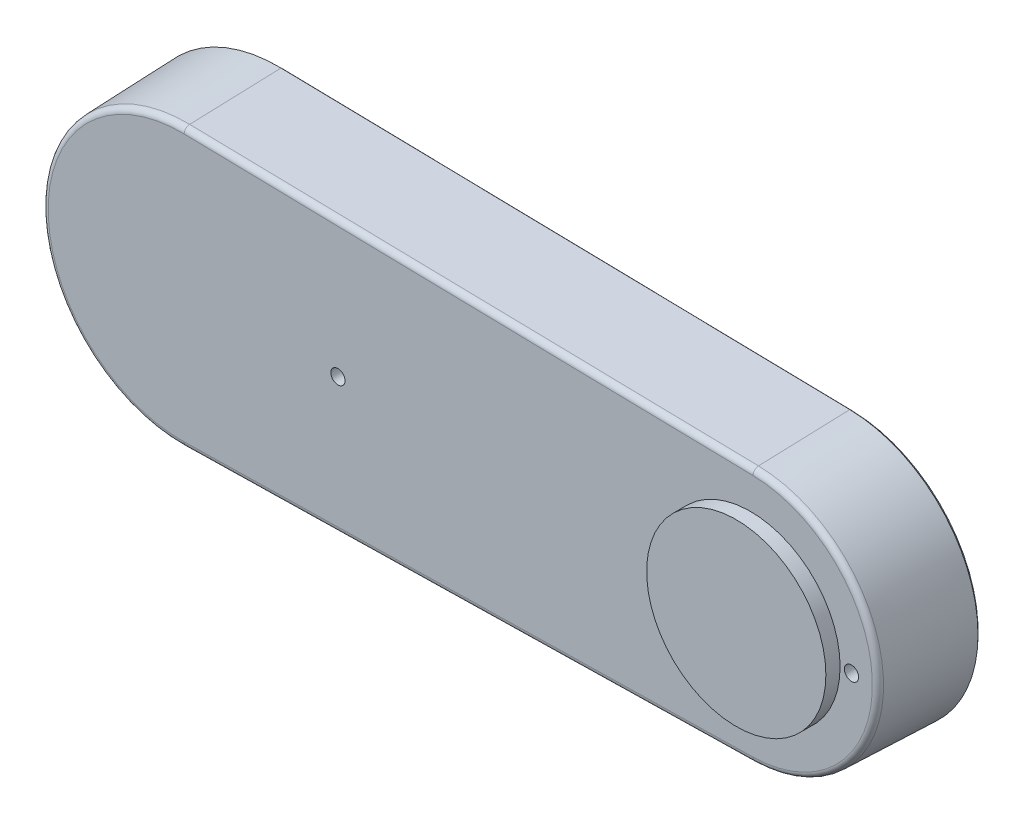
ISO-10303-21;
HEADER;
FILE_DESCRIPTION(('STEP AP214'),'2;1');
FILE_NAME('part.step','',(''),(''),'','','');
FILE_SCHEMA(('AUTOMOTIVE_DESIGN { 1 0 10303 214 1 1 1 1 }'));
ENDSEC;
DATA;
#1=APPLICATION_CONTEXT('core data for automotive mechanical design processes');
#2=APPLICATION_PROTOCOL_DEFINITION('international standard','automotive_design',2000,#1);
#3=PRODUCT_CONTEXT('',#1,'mechanical');
#4=PRODUCT('Part','Part','',(#3));
#5=PRODUCT_RELATED_PRODUCT_CATEGORY('part','',(#4));
#6=PRODUCT_DEFINITION_FORMATION('','',#4);
#7=PRODUCT_DEFINITION_CONTEXT('part definition',#1,'design');
#8=PRODUCT_DEFINITION('design','',#6,#7);
#9=PRODUCT_DEFINITION_SHAPE('','',#8);
#10=(LENGTH_UNIT() NAMED_UNIT(*) SI_UNIT(.MILLI.,.METRE.));
#11=(NAMED_UNIT(*) PLANE_ANGLE_UNIT() SI_UNIT($,.RADIAN.));
#12=(NAMED_UNIT(*) SI_UNIT($,.STERADIAN.) SOLID_ANGLE_UNIT());
#13=UNCERTAINTY_MEASURE_WITH_UNIT(LENGTH_MEASURE(1.E-05),#10,'distance_accuracy_value','');
#14=(GEOMETRIC_REPRESENTATION_CONTEXT(3) GLOBAL_UNCERTAINTY_ASSIGNED_CONTEXT((#13)) GLOBAL_UNIT_ASSIGNED_CONTEXT((#10,
#11,#12)) REPRESENTATION_CONTEXT('',''));
#15=CARTESIAN_POINT('',(0.,0.,0.));
#16=DIRECTION('',(0.,0.,1.));
#17=DIRECTION('',(1.,0.,0.));
#18=AXIS2_PLACEMENT_3D('',#15,#16,#17);
#19=CARTESIAN_POINT('',(0.,0.,0.));
#20=DIRECTION('',(0.,0.,-1.));
#21=DIRECTION('',(1.,0.,0.));
#22=AXIS2_PLACEMENT_3D('',#19,#20,#21);
#23=CYLINDRICAL_SURFACE('',#22,35.);
#24=CARTESIAN_POINT('',(0.,0.,-2.));
#25=DIRECTION('',(0.,0.,-1.));
#26=DIRECTION('',(1.,0.,0.));
#27=AXIS2_PLACEMENT_3D('',#24,#25,#26);
#28=CIRCLE('',#27,35.);
#29=CARTESIAN_POINT('',(-35.,0.,-2.));
#30=VERTEX_POINT('',#29);
#31=EDGE_CURVE('E11',#30,#30,#28,.T.);
#32=ORIENTED_EDGE('',*,*,#31,.F.);
#33=EDGE_LOOP('',(#32));
#34=FACE_BOUND('',#33,.T.);
#35=CARTESIAN_POINT('',(0.,0.,0.));
#36=DIRECTION('',(0.,0.,1.));
#37=DIRECTION('',(1.,0.,0.));
#38=AXIS2_PLACEMENT_3D('',#35,#36,#37);
#39=CIRCLE('',#38,35.);
#40=CARTESIAN_POINT('',(-35.,0.,0.));
#41=VERTEX_POINT('',#40);
#42=EDGE_CURVE('E318',#41,#41,#39,.T.);
#43=ORIENTED_EDGE('',*,*,#42,.F.);
#44=EDGE_LOOP('',(#43));
#45=FACE_BOUND('',#44,.T.);
#46=ADVANCED_FACE('F16',(#34,#45),#23,.T.);
#47=CARTESIAN_POINT('',(0.,0.,-2.));
#48=DIRECTION('',(0.,0.,1.));
#49=DIRECTION('',(1.,0.,0.));
#50=AXIS2_PLACEMENT_3D('',#47,#48,#49);
#51=PLANE('',#50);
#52=ORIENTED_EDGE('',*,*,#31,.T.);
#53=EDGE_LOOP('',(#52));
#54=FACE_BOUND('',#53,.T.);
#55=ADVANCED_FACE('F597',(#54),#51,.F.);
#56=CARTESIAN_POINT('',(200.,0.,35.));
#57=DIRECTION('',(0.,0.,1.));
#58=DIRECTION('',(-1.,0.,0.));
#59=AXIS2_PLACEMENT_3D('',#56,#57,#58);
#60=CYLINDRICAL_SURFACE('',#59,31.5);
#61=CARTESIAN_POINT('',(200.,0.,40.));
#62=DIRECTION('',(0.,0.,1.));
#63=DIRECTION('',(-1.,0.,0.));
#64=AXIS2_PLACEMENT_3D('',#61,#62,#63);
#65=CIRCLE('',#64,31.5);
#66=CARTESIAN_POINT('',(231.5,0.,40.));
#67=VERTEX_POINT('',#66);
#68=EDGE_CURVE('E27',#67,#67,#65,.T.);
#69=ORIENTED_EDGE('',*,*,#68,.F.);
#70=EDGE_LOOP('',(#69));
#71=FACE_BOUND('',#70,.T.);
#72=CARTESIAN_POINT('',(200.,0.,35.));
#73=DIRECTION('',(0.,0.,-1.));
#74=DIRECTION('',(-1.,0.,0.));
#75=AXIS2_PLACEMENT_3D('',#72,#73,#74);
#76=CIRCLE('',#75,31.5);
#77=CARTESIAN_POINT('',(231.5,0.,35.));
#78=VERTEX_POINT('',#77);
#79=EDGE_CURVE('E210',#78,#78,#76,.T.);
#80=ORIENTED_EDGE('',*,*,#79,.F.);
#81=EDGE_LOOP('',(#80));
#82=FACE_BOUND('',#81,.T.);
#83=ADVANCED_FACE('F564',(#71,#82),#60,.T.);
#84=CARTESIAN_POINT('',(200.,0.,40.));
#85=DIRECTION('',(0.,0.,1.));
#86=DIRECTION('',(1.,0.,0.));
#87=AXIS2_PLACEMENT_3D('',#84,#85,#86);
#88=PLANE('',#87);
#89=ORIENTED_EDGE('',*,*,#68,.T.);
#90=EDGE_LOOP('',(#89));
#91=FACE_BOUND('',#90,.T.);
#92=ADVANCED_FACE('F671',(#91),#88,.T.);
#93=CARTESIAN_POINT('',(1.15304901043833E-13,-2.13370987545148E-13,0.));
#94=DIRECTION('',(0.,0.,1.));
#95=DIRECTION('',(0.0199999999999973,-0.999799979995999,0.));
#96=AXIS2_PLACEMENT_3D('',#93,#94,#95);
#97=CYLINDRICAL_SURFACE('',#96,45.9965079230508);
#98=CARTESIAN_POINT('',(1.15304901043833E-13,-2.13370987545148E-13,0.0999999999999979));
#99=DIRECTION('',(0.,0.,1.));
#100=DIRECTION('',(-1.,0.,0.));
#101=AXIS2_PLACEMENT_3D('',#98,#99,#100);
#102=CIRCLE('',#101,45.9965079230508);
#103=CARTESIAN_POINT('',(0.919930158460969,45.9873077013521,0.0999999999999979));
#104=VERTEX_POINT('',#103);
#105=CARTESIAN_POINT('',(0.919930158461004,-45.9873077013521,0.0999999999999979));
#106=VERTEX_POINT('',#105);
#107=EDGE_CURVE('E284',#104,#106,#102,.T.);
#108=ORIENTED_EDGE('',*,*,#107,.F.);
#109=DIRECTION('',(0.,0.,1.));
#110=VECTOR('',#109,1.);
#111=CARTESIAN_POINT('',(0.919930158460969,45.9873077013521,0.));
#112=LINE('',#111,#110);
#113=CARTESIAN_POINT('',(0.919930158460969,45.9873077013521,0.));
#114=VERTEX_POINT('',#113);
#115=EDGE_CURVE('E247',#114,#104,#112,.T.);
#116=ORIENTED_EDGE('',*,*,#115,.F.);
#117=CARTESIAN_POINT('',(1.15304901043833E-13,-2.13370987545148E-13,0.));
#118=DIRECTION('',(0.,0.,-1.));
#119=DIRECTION('',(0.0199999999999973,-0.999799979995999,0.));
#120=AXIS2_PLACEMENT_3D('',#117,#118,#119);
#121=CIRCLE('',#120,45.9965079230508);
#122=CARTESIAN_POINT('',(0.919930158461004,-45.9873077013521,0.));
#123=VERTEX_POINT('',#122);
#124=EDGE_CURVE('E241',#123,#114,#121,.T.);
#125=ORIENTED_EDGE('',*,*,#124,.F.);
#126=DIRECTION('',(0.,0.,1.));
#127=VECTOR('',#126,1.);
#128=CARTESIAN_POINT('',(0.919930158461004,-45.9873077013521,0.));
#129=LINE('',#128,#127);
#130=EDGE_CURVE('E243',#123,#106,#129,.T.);
#131=ORIENTED_EDGE('',*,*,#130,.T.);
#132=EDGE_LOOP('',(#108,#116,#125,#131));
#133=FACE_BOUND('',#132,.T.);
#134=ADVANCED_FACE('F693',(#133),#97,.T.);
#135=CARTESIAN_POINT('',(200.839930158461,41.9881077813681,0.));
#136=DIRECTION('',(0.0200000000000003,0.999799979995999,0.));
#137=DIRECTION('',(0.,0.,-1.));
#138=AXIS2_PLACEMENT_3D('',#135,#136,#137);
#139=PLANE('',#138);
#140=DIRECTION('',(-0.999799979995999,0.02,0.));
#141=VECTOR('',#140,1.);
#142=CARTESIAN_POINT('',(49.900330158461,45.007503720956,0.0999999999999979));
#143=LINE('',#142,#141);
#144=CARTESIAN_POINT('',(200.839930158461,41.9881077813681,0.0999999999999979));
#145=VERTEX_POINT('',#144);
#146=EDGE_CURVE('E345',#145,#104,#143,.T.);
#147=ORIENTED_EDGE('',*,*,#146,.F.);
#148=DIRECTION('',(0.,0.,1.));
#149=VECTOR('',#148,1.);
#150=CARTESIAN_POINT('',(200.839930158461,41.9881077813681,0.));
#151=LINE('',#150,#149);
#152=CARTESIAN_POINT('',(200.839930158461,41.9881077813681,0.));
#153=VERTEX_POINT('',#152);
#154=EDGE_CURVE('E436',#153,#145,#151,.T.);
#155=ORIENTED_EDGE('',*,*,#154,.F.);
#156=DIRECTION('',(0.999799979995999,-0.0200000000000003,0.));
#157=VECTOR('',#156,1.);
#158=CARTESIAN_POINT('',(0.919930158460964,45.9873077013521,0.));
#159=LINE('',#158,#157);
#160=EDGE_CURVE('E466',#114,#153,#159,.T.);
#161=ORIENTED_EDGE('',*,*,#160,.F.);
#162=ORIENTED_EDGE('',*,*,#115,.T.);
#163=EDGE_LOOP('',(#147,#155,#161,#162));
#164=FACE_BOUND('',#163,.T.);
#165=ADVANCED_FACE('F698',(#164),#139,.T.);
#166=CARTESIAN_POINT('',(55.,0.,0.));
#167=DIRECTION('',(0.,0.,1.));
#168=DIRECTION('',(1.,0.,0.));
#169=AXIS2_PLACEMENT_3D('',#166,#167,#168);
#170=CYLINDRICAL_SURFACE('',#169,4.81715561259646);
#171=CARTESIAN_POINT('',(55.,0.,0.));
#172=DIRECTION('',(0.,0.,1.));
#173=DIRECTION('',(1.,0.,0.));
#174=AXIS2_PLACEMENT_3D('',#171,#172,#173);
#175=CIRCLE('',#174,4.81715561259646);
#176=CARTESIAN_POINT('',(50.1828443874035,0.,0.));
#177=VERTEX_POINT('',#176);
#178=EDGE_CURVE('E294',#177,#177,#175,.T.);
#179=ORIENTED_EDGE('',*,*,#178,.F.);
#180=EDGE_LOOP('',(#179));
#181=FACE_BOUND('',#180,.T.);
#182=CARTESIAN_POINT('',(55.,0.,0.0999999999999979));
#183=DIRECTION('',(0.,0.,-1.));
#184=DIRECTION('',(-1.,0.,0.));
#185=AXIS2_PLACEMENT_3D('',#182,#183,#184);
#186=CIRCLE('',#185,4.81715561259646);
#187=CARTESIAN_POINT('',(50.1828443874035,0.,0.1));
#188=VERTEX_POINT('',#187);
#189=EDGE_CURVE('E288',#188,#188,#186,.T.);
#190=ORIENTED_EDGE('',*,*,#189,.F.);
#191=EDGE_LOOP('',(#190));
#192=FACE_BOUND('',#191,.T.);
#193=ADVANCED_FACE('F613',(#181,#192),#170,.F.);
#194=CARTESIAN_POINT('',(200.,0.,0.));
#195=DIRECTION('',(0.,0.,1.));
#196=DIRECTION('',(0.0199999999999995,0.999799979995999,0.));
#197=AXIS2_PLACEMENT_3D('',#194,#195,#196);
#198=CYLINDRICAL_SURFACE('',#197,41.9965079230508);
#199=CARTESIAN_POINT('',(200.,0.,0.0999999999999979));
#200=DIRECTION('',(0.,0.,1.));
#201=DIRECTION('',(-1.,0.,0.));
#202=AXIS2_PLACEMENT_3D('',#199,#200,#201);
#203=CIRCLE('',#202,41.9965079230508);
#204=CARTESIAN_POINT('',(200.839930158461,-41.9881077813681,0.0999999999999979));
#205=VERTEX_POINT('',#204);
#206=EDGE_CURVE('E383',#205,#145,#203,.T.);
#207=ORIENTED_EDGE('',*,*,#206,.F.);
#208=DIRECTION('',(0.,0.,1.));
#209=VECTOR('',#208,1.);
#210=CARTESIAN_POINT('',(200.839930158461,-41.9881077813681,0.));
#211=LINE('',#210,#209);
#212=CARTESIAN_POINT('',(200.839930158461,-41.9881077813681,0.));
#213=VERTEX_POINT('',#212);
#214=EDGE_CURVE('E432',#213,#205,#211,.T.);
#215=ORIENTED_EDGE('',*,*,#214,.F.);
#216=CARTESIAN_POINT('',(200.,0.,0.));
#217=DIRECTION('',(0.,0.,-1.));
#218=DIRECTION('',(0.0199999999999995,0.999799979995999,0.));
#219=AXIS2_PLACEMENT_3D('',#216,#217,#218);
#220=CIRCLE('',#219,41.9965079230508);
#221=EDGE_CURVE('E344',#153,#213,#220,.T.);
#222=ORIENTED_EDGE('',*,*,#221,.F.);
#223=ORIENTED_EDGE('',*,*,#154,.T.);
#224=EDGE_LOOP('',(#207,#215,#222,#223));
#225=FACE_BOUND('',#224,.T.);
#226=ADVANCED_FACE('F609',(#225),#198,.T.);
#227=CARTESIAN_POINT('',(0.919930158460964,-45.9873077013521,0.));
#228=DIRECTION('',(0.0200000000000003,-0.999799979995999,0.));
#229=DIRECTION('',(0.,0.,-1.));
#230=AXIS2_PLACEMENT_3D('',#227,#228,#229);
#231=PLANE('',#230);
#232=DIRECTION('',(0.999799979995999,0.02,0.));
#233=VECTOR('',#232,1.);
#234=CARTESIAN_POINT('',(149.860330158461,-43.007903760964,0.0999999999999979));
#235=LINE('',#234,#233);
#236=EDGE_CURVE('E330',#106,#205,#235,.T.);
#237=ORIENTED_EDGE('',*,*,#236,.F.);
#238=ORIENTED_EDGE('',*,*,#130,.F.);
#239=DIRECTION('',(-0.999799979995999,-0.0200000000000003,0.));
#240=VECTOR('',#239,1.);
#241=CARTESIAN_POINT('',(200.839930158461,-41.9881077813681,0.));
#242=LINE('',#241,#240);
#243=EDGE_CURVE('E321',#213,#123,#242,.T.);
#244=ORIENTED_EDGE('',*,*,#243,.F.);
#245=ORIENTED_EDGE('',*,*,#214,.T.);
#246=EDGE_LOOP('',(#237,#238,#244,#245));
#247=FACE_BOUND('',#246,.T.);
#248=ADVANCED_FACE('F612',(#247),#231,.T.);
#249=CARTESIAN_POINT('',(97.7238994753147,0.,0.));
#250=DIRECTION('',(0.,0.,1.));
#251=DIRECTION('',(1.,0.,0.));
#252=AXIS2_PLACEMENT_3D('',#249,#250,#251);
#253=PLANE('',#252);
#254=ORIENTED_EDGE('',*,*,#124,.T.);
#255=ORIENTED_EDGE('',*,*,#160,.T.);
#256=ORIENTED_EDGE('',*,*,#221,.T.);
#257=ORIENTED_EDGE('',*,*,#243,.T.);
#258=EDGE_LOOP('',(#254,#255,#256,#257));
#259=FACE_BOUND('',#258,.T.);
#260=ORIENTED_EDGE('',*,*,#42,.T.);
#261=EDGE_LOOP('',(#260));
#262=FACE_BOUND('',#261,.T.);
#263=ORIENTED_EDGE('',*,*,#178,.T.);
#264=EDGE_LOOP('',(#263));
#265=FACE_BOUND('',#264,.T.);
#266=CARTESIAN_POINT('',(235.5,0.,0.));
#267=DIRECTION('',(0.,0.,1.));
#268=DIRECTION('',(1.,0.,0.));
#269=AXIS2_PLACEMENT_3D('',#266,#267,#268);
#270=CIRCLE('',#269,2.5);
#271=CARTESIAN_POINT('',(233.,0.,0.));
#272=VERTEX_POINT('',#271);
#273=EDGE_CURVE('E290',#272,#272,#270,.T.);
#274=ORIENTED_EDGE('',*,*,#273,.T.);
#275=EDGE_LOOP('',(#274));
#276=FACE_BOUND('',#275,.T.);
#277=ADVANCED_FACE('F623',(#259,#262,#265,#276),#253,.F.);
#278=CARTESIAN_POINT('',(235.5,0.,35.));
#279=DIRECTION('',(0.,0.,-1.));
#280=DIRECTION('',(-1.,0.,0.));
#281=AXIS2_PLACEMENT_3D('',#278,#279,#280);
#282=CYLINDRICAL_SURFACE('',#281,2.5);
#283=ORIENTED_EDGE('',*,*,#273,.F.);
#284=EDGE_LOOP('',(#283));
#285=FACE_BOUND('',#284,.T.);
#286=CARTESIAN_POINT('',(235.5,0.,8.));
#287=DIRECTION('',(0.,0.,-1.));
#288=DIRECTION('',(-1.,0.,0.));
#289=AXIS2_PLACEMENT_3D('',#286,#287,#288);
#290=CIRCLE('',#289,2.5);
#291=CARTESIAN_POINT('',(234.359432606198,2.2246586300363,8.));
#292=VERTEX_POINT('',#291);
#293=CARTESIAN_POINT('',(234.359432606198,-2.22465863003635,8.));
#294=VERTEX_POINT('',#293);
#295=EDGE_CURVE('E283',#292,#294,#290,.T.);
#296=ORIENTED_EDGE('',*,*,#295,.F.);
#297=DIRECTION('',(0.,0.,-1.));
#298=VECTOR('',#297,1.);
#299=CARTESIAN_POINT('',(234.359432606198,2.2246586300363,35.));
#300=LINE('',#299,#298);
#301=CARTESIAN_POINT('',(234.359432606198,2.2246586300363,8.1));
#302=VERTEX_POINT('',#301);
#303=EDGE_CURVE('E359',#302,#292,#300,.T.);
#304=ORIENTED_EDGE('',*,*,#303,.F.);
#305=CARTESIAN_POINT('',(235.5,0.,8.1));
#306=DIRECTION('',(0.,0.,-1.));
#307=DIRECTION('',(-1.,0.,0.));
#308=AXIS2_PLACEMENT_3D('',#305,#306,#307);
#309=CIRCLE('',#308,2.5);
#310=CARTESIAN_POINT('',(234.359432606198,-2.22465863003635,8.1));
#311=VERTEX_POINT('',#310);
#312=EDGE_CURVE('E295',#311,#302,#309,.T.);
#313=ORIENTED_EDGE('',*,*,#312,.F.);
#314=DIRECTION('',(0.,0.,1.));
#315=VECTOR('',#314,1.);
#316=CARTESIAN_POINT('',(234.359432606198,-2.22465863003635,35.));
#317=LINE('',#316,#315);
#318=EDGE_CURVE('E282',#294,#311,#317,.T.);
#319=ORIENTED_EDGE('',*,*,#318,.F.);
#320=EDGE_LOOP('',(#296,#304,#313,#319));
#321=FACE_BOUND('',#320,.T.);
#322=ADVANCED_FACE('F506',(#285,#321),#282,.F.);
#323=CARTESIAN_POINT('',(231.030208103198,-1.11022302462516E-13,8.1));
#324=DIRECTION('',(0.,0.,-1.));
#325=DIRECTION('',(0.,-1.,0.));
#326=AXIS2_PLACEMENT_3D('',#323,#324,#325);
#327=PLANE('',#326);
#328=ORIENTED_EDGE('',*,*,#312,.T.);
#329=CARTESIAN_POINT('',(231.030208103198,-1.11022302462516E-13,8.1));
#330=DIRECTION('',(0.,0.,-1.));
#331=DIRECTION('',(-1.,0.,0.));
#332=AXIS2_PLACEMENT_3D('',#329,#330,#331);
#333=CIRCLE('',#332,4.00410312199484);
#334=CARTESIAN_POINT('',(234.611122176087,1.79161832267801,8.1));
#335=VERTEX_POINT('',#334);
#336=EDGE_CURVE('E301',#302,#335,#333,.T.);
#337=ORIENTED_EDGE('',*,*,#336,.T.);
#338=CARTESIAN_POINT('',(235.5,0.,8.1));
#339=DIRECTION('',(0.,0.,1.));
#340=DIRECTION('',(-1.,0.,0.));
#341=AXIS2_PLACEMENT_3D('',#338,#339,#340);
#342=CIRCLE('',#341,2.);
#343=CARTESIAN_POINT('',(234.611122176087,-1.79161832267805,8.1));
#344=VERTEX_POINT('',#343);
#345=EDGE_CURVE('E305',#335,#344,#342,.T.);
#346=ORIENTED_EDGE('',*,*,#345,.T.);
#347=CARTESIAN_POINT('',(231.030208103198,-1.11022302462516E-13,8.1));
#348=DIRECTION('',(0.,0.,-1.));
#349=DIRECTION('',(-1.,0.,0.));
#350=AXIS2_PLACEMENT_3D('',#347,#348,#349);
#351=CIRCLE('',#350,4.00410312199484);
#352=EDGE_CURVE('E355',#344,#311,#351,.T.);
#353=ORIENTED_EDGE('',*,*,#352,.T.);
#354=EDGE_LOOP('',(#328,#337,#346,#353));
#355=FACE_BOUND('',#354,.T.);
#356=ADVANCED_FACE('F501',(#355),#327,.T.);
#357=CARTESIAN_POINT('',(231.030208103198,-1.11022302462516E-13,8.1));
#358=DIRECTION('',(0.,0.,-1.));
#359=DIRECTION('',(-1.,0.,0.));
#360=AXIS2_PLACEMENT_3D('',#357,#358,#359);
#361=CYLINDRICAL_SURFACE('',#360,4.00410312199484);
#362=ORIENTED_EDGE('',*,*,#303,.T.);
#363=CARTESIAN_POINT('',(231.030208103198,-1.11022302462516E-13,8.));
#364=DIRECTION('',(0.,0.,-1.));
#365=DIRECTION('',(-1.,0.,0.));
#366=AXIS2_PLACEMENT_3D('',#363,#364,#365);
#367=CIRCLE('',#366,4.00410312199484);
#368=CARTESIAN_POINT('',(234.611122176087,1.791618322678,8.));
#369=VERTEX_POINT('',#368);
#370=EDGE_CURVE('E354',#292,#369,#367,.T.);
#371=ORIENTED_EDGE('',*,*,#370,.T.);
#372=DIRECTION('',(0.,0.,-1.));
#373=VECTOR('',#372,1.);
#374=CARTESIAN_POINT('',(234.611122176087,1.791618322678,4.09299413443885));
#375=LINE('',#374,#373);
#376=EDGE_CURVE('E317',#335,#369,#375,.T.);
#377=ORIENTED_EDGE('',*,*,#376,.F.);
#378=ORIENTED_EDGE('',*,*,#336,.F.);
#379=EDGE_LOOP('',(#362,#371,#377,#378));
#380=FACE_BOUND('',#379,.T.);
#381=ADVANCED_FACE('F490',(#380),#361,.F.);
#382=CARTESIAN_POINT('',(231.030208103198,-1.11022302462516E-13,8.1));
#383=DIRECTION('',(0.,0.,-1.));
#384=DIRECTION('',(-1.,0.,0.));
#385=AXIS2_PLACEMENT_3D('',#382,#383,#384);
#386=CYLINDRICAL_SURFACE('',#385,4.00410312199484);
#387=ORIENTED_EDGE('',*,*,#318,.T.);
#388=ORIENTED_EDGE('',*,*,#352,.F.);
#389=DIRECTION('',(0.,0.,1.));
#390=VECTOR('',#389,1.);
#391=CARTESIAN_POINT('',(234.611122176087,-1.79161832267805,4.09299413443885));
#392=LINE('',#391,#390);
#393=CARTESIAN_POINT('',(234.611122176087,-1.79161832267805,8.));
#394=VERTEX_POINT('',#393);
#395=EDGE_CURVE('E261',#394,#344,#392,.T.);
#396=ORIENTED_EDGE('',*,*,#395,.F.);
#397=CARTESIAN_POINT('',(231.030208103198,-1.11022302462516E-13,8.));
#398=DIRECTION('',(0.,0.,-1.));
#399=DIRECTION('',(-1.,0.,0.));
#400=AXIS2_PLACEMENT_3D('',#397,#398,#399);
#401=CIRCLE('',#400,4.00410312199484);
#402=EDGE_CURVE('E278',#394,#294,#401,.T.);
#403=ORIENTED_EDGE('',*,*,#402,.T.);
#404=EDGE_LOOP('',(#387,#388,#396,#403));
#405=FACE_BOUND('',#404,.T.);
#406=ADVANCED_FACE('F637',(#405),#386,.F.);
#407=CARTESIAN_POINT('',(242.071678792946,-43.8281645343403,8.));
#408=DIRECTION('',(0.,0.,-1.));
#409=DIRECTION('',(0.,-1.,0.));
#410=AXIS2_PLACEMENT_3D('',#407,#408,#409);
#411=PLANE('',#410);
#412=ORIENTED_EDGE('',*,*,#295,.T.);
#413=ORIENTED_EDGE('',*,*,#402,.F.);
#414=CARTESIAN_POINT('',(235.5,0.,8.));
#415=DIRECTION('',(0.,0.,1.));
#416=DIRECTION('',(-1.,0.,0.));
#417=AXIS2_PLACEMENT_3D('',#414,#415,#416);
#418=CIRCLE('',#417,2.);
#419=EDGE_CURVE('E413',#394,#369,#418,.T.);
#420=ORIENTED_EDGE('',*,*,#419,.T.);
#421=ORIENTED_EDGE('',*,*,#370,.F.);
#422=EDGE_LOOP('',(#412,#413,#420,#421));
#423=FACE_BOUND('',#422,.T.);
#424=ADVANCED_FACE('F497',(#423),#411,.T.);
#425=CARTESIAN_POINT('',(200.,0.,0.));
#426=DIRECTION('',(0.,0.,-1.));
#427=DIRECTION('',(-1.,0.,0.));
#428=AXIS2_PLACEMENT_3D('',#425,#426,#427);
#429=CONICAL_SURFACE('',#428,42.,0.0349065850398857);
#430=ORIENTED_EDGE('',*,*,#206,.T.);
#431=DIRECTION('',(-0.000697989934052874,-0.034892516105033,0.999390827019096));
#432=VECTOR('',#431,1.);
#433=CARTESIAN_POINT('',(200.829174561458,41.4504354979229,15.5));
#434=LINE('',#433,#432);
#435=CARTESIAN_POINT('',(200.84,41.991599159832,0.));
#436=VERTEX_POINT('',#435);
#437=EDGE_CURVE('E401',#436,#145,#434,.T.);
#438=ORIENTED_EDGE('',*,*,#437,.F.);
#439=CARTESIAN_POINT('',(200.,0.,0.));
#440=DIRECTION('',(0.,0.,-1.));
#441=DIRECTION('',(-1.,0.,0.));
#442=AXIS2_PLACEMENT_3D('',#439,#440,#441);
#443=CIRCLE('',#442,42.);
#444=CARTESIAN_POINT('',(200.84,-41.991599159832,0.));
#445=VERTEX_POINT('',#444);
#446=EDGE_CURVE('E349',#436,#445,#443,.T.);
#447=ORIENTED_EDGE('',*,*,#446,.T.);
#448=DIRECTION('',(0.000697989934052874,-0.034892516105033,-0.999390827019096));
#449=VECTOR('',#448,1.);
#450=CARTESIAN_POINT('',(200.829174561458,-41.4504354979229,15.5));
#451=LINE('',#450,#449);
#452=EDGE_CURVE('E326',#205,#445,#451,.T.);
#453=ORIENTED_EDGE('',*,*,#452,.F.);
#454=EDGE_LOOP('',(#430,#438,#447,#453));
#455=FACE_BOUND('',#454,.T.);
#456=ADVANCED_FACE('F636',(#455),#429,.F.);
#457=CARTESIAN_POINT('',(0.919999999999952,45.990799079816,0.));
#458=DIRECTION('',(-0.0199878165403819,-0.999190928861877,-0.0348994967025002));
#459=DIRECTION('',(0.,0.0349064701900665,-0.999390583475185));
#460=AXIS2_PLACEMENT_3D('',#457,#458,#459);
#461=PLANE('',#460);
#462=ORIENTED_EDGE('',*,*,#146,.T.);
#463=DIRECTION('',(0.000697989934049673,0.0348925161050301,-0.999390827019096));
#464=VECTOR('',#463,1.);
#465=CARTESIAN_POINT('',(0.909174561457516,45.449635417907,15.5));
#466=LINE('',#465,#464);
#467=CARTESIAN_POINT('',(0.919999999999952,45.990799079816,0.));
#468=VERTEX_POINT('',#467);
#469=EDGE_CURVE('E350',#104,#468,#466,.T.);
#470=ORIENTED_EDGE('',*,*,#469,.T.);
#471=DIRECTION('',(0.999799979995999,-0.02,0.));
#472=VECTOR('',#471,1.);
#473=CARTESIAN_POINT('',(0.919999999999952,45.990799079816,0.));
#474=LINE('',#473,#472);
#475=EDGE_CURVE('E400',#468,#436,#474,.T.);
#476=ORIENTED_EDGE('',*,*,#475,.T.);
#477=ORIENTED_EDGE('',*,*,#437,.T.);
#478=EDGE_LOOP('',(#462,#470,#476,#477));
#479=FACE_BOUND('',#478,.T.);
#480=ADVANCED_FACE('F619',(#479),#461,.T.);
#481=CARTESIAN_POINT('',(100.949651005033,47.4730527917575,0.499695413509548));
#482=DIRECTION('',(0.0143867960067731,0.719195917988911,-0.694658370458996));
#483=DIRECTION('',(-0.999785604361794,0.,-0.0207061660121614));
#484=AXIS2_PLACEMENT_3D('',#481,#482,#483);
#485=PLANE('',#484);
#486=DIRECTION('',(0.013893167409185,0.694519424888954,0.719339800338655));
#487=VECTOR('',#486,1.);
#488=CARTESIAN_POINT('',(0.979999999999883,48.990199019804,0.));
#489=LINE('',#488,#487);
#490=CARTESIAN_POINT('',(0.979999999999883,48.990199019804,0.));
#491=VERTEX_POINT('',#490);
#492=CARTESIAN_POINT('',(0.99930201006584,49.955106483695,0.999390827019096));
#493=VERTEX_POINT('',#492);
#494=EDGE_CURVE('E405',#491,#493,#489,.T.);
#495=ORIENTED_EDGE('',*,*,#494,.T.);
#496=DIRECTION('',(0.999799979995999,-0.02,0.));
#497=VECTOR('',#496,1.);
#498=CARTESIAN_POINT('',(100.959302010066,47.955506523703,0.999390827019096));
#499=LINE('',#498,#497);
#500=CARTESIAN_POINT('',(200.919302010066,45.955906563711,0.999390827019096));
#501=VERTEX_POINT('',#500);
#502=EDGE_CURVE('E20',#493,#501,#499,.T.);
#503=ORIENTED_EDGE('',*,*,#502,.T.);
#504=DIRECTION('',(-0.013893167409149,-0.694519424888958,-0.719339800338653));
#505=VECTOR('',#504,1.);
#506=CARTESIAN_POINT('',(200.919302010066,45.955906563711,0.999390827019096));
#507=LINE('',#506,#505);
#508=CARTESIAN_POINT('',(200.9,44.99099909982,0.));
#509=VERTEX_POINT('',#508);
#510=EDGE_CURVE('E296',#501,#509,#507,.T.);
#511=ORIENTED_EDGE('',*,*,#510,.T.);
#512=DIRECTION('',(-0.999799979995999,0.02,0.));
#513=VECTOR('',#512,1.);
#514=CARTESIAN_POINT('',(100.94,46.990599059812,0.));
#515=LINE('',#514,#513);
#516=EDGE_CURVE('E300',#509,#491,#515,.T.);
#517=ORIENTED_EDGE('',*,*,#516,.T.);
#518=EDGE_LOOP('',(#495,#503,#511,#517));
#519=FACE_BOUND('',#518,.T.);
#520=ADVANCED_FACE('F615',(#519),#485,.T.);
#521=CARTESIAN_POINT('',(1.15384047802425E-13,-2.14900727555158E-13,0.499695413509547));
#522=DIRECTION('',(0.,0.,1.));
#523=DIRECTION('',(-1.,0.,0.));
#524=AXIS2_PLACEMENT_3D('',#521,#522,#523);
#525=CONICAL_SURFACE('',#524,49.4825502516488,0.767944870877504);
#526=DIRECTION('',(0.0138931674091798,-0.694519424889011,0.719339800338601));
#527=VECTOR('',#526,1.);
#528=CARTESIAN_POINT('',(0.98,-48.9901990198042,0.));
#529=LINE('',#528,#527);
#530=CARTESIAN_POINT('',(0.98,-48.9901990198042,0.));
#531=VERTEX_POINT('',#530);
#532=CARTESIAN_POINT('',(0.99930201006595,-49.9551064836953,0.999390827019093));
#533=VERTEX_POINT('',#532);
#534=EDGE_CURVE('E366',#531,#533,#529,.T.);
#535=ORIENTED_EDGE('',*,*,#534,.T.);
#536=CARTESIAN_POINT('',(1.15463194561016E-13,-2.16430467565169E-13,0.999390827019093));
#537=DIRECTION('',(0.,0.,-1.));
#538=DIRECTION('',(-1.,0.,0.));
#539=AXIS2_PLACEMENT_3D('',#536,#537,#538);
#540=CIRCLE('',#539,49.9651005032975);
#541=EDGE_CURVE('E363',#533,#493,#540,.T.);
#542=ORIENTED_EDGE('',*,*,#541,.T.);
#543=ORIENTED_EDGE('',*,*,#494,.F.);
#544=CARTESIAN_POINT('',(1.15304901043833E-13,-2.13370987545148E-13,0.));
#545=DIRECTION('',(0.,0.,1.));
#546=DIRECTION('',(-1.,0.,0.));
#547=AXIS2_PLACEMENT_3D('',#544,#545,#546);
#548=CIRCLE('',#547,49.);
#549=EDGE_CURVE('E367',#491,#531,#548,.T.);
#550=ORIENTED_EDGE('',*,*,#549,.T.);
#551=EDGE_LOOP('',(#535,#542,#543,#550));
#552=FACE_BOUND('',#551,.T.);
#553=ADVANCED_FACE('F618',(#552),#525,.T.);
#554=CARTESIAN_POINT('',(0.989651005032996,-49.4726527517496,0.499695413509548));
#555=DIRECTION('',(0.0143867960067734,-0.719195917988911,-0.694658370458996));
#556=DIRECTION('',(0.,0.694730271780581,-0.719270359094325));
#557=AXIS2_PLACEMENT_3D('',#554,#555,#556);
#558=PLANE('',#557);
#559=DIRECTION('',(0.013893167409149,-0.694519424888955,0.719339800338656));
#560=VECTOR('',#559,1.);
#561=CARTESIAN_POINT('',(200.9,-44.99099909982,0.));
#562=LINE('',#561,#560);
#563=CARTESIAN_POINT('',(200.9,-44.99099909982,0.));
#564=VERTEX_POINT('',#563);
#565=CARTESIAN_POINT('',(200.919302010066,-45.955906563711,0.999390827019096));
#566=VERTEX_POINT('',#565);
#567=EDGE_CURVE('E456',#564,#566,#562,.T.);
#568=ORIENTED_EDGE('',*,*,#567,.T.);
#569=DIRECTION('',(-0.999799979995999,-0.0200000000000005,0.));
#570=VECTOR('',#569,1.);
#571=CARTESIAN_POINT('',(0.999302010065972,-49.9551064836951,0.999390827019096));
#572=LINE('',#571,#570);
#573=EDGE_CURVE('E273',#566,#533,#572,.T.);
#574=ORIENTED_EDGE('',*,*,#573,.T.);
#575=ORIENTED_EDGE('',*,*,#534,.F.);
#576=DIRECTION('',(0.999799979995999,0.0200000000000005,0.));
#577=VECTOR('',#576,1.);
#578=CARTESIAN_POINT('',(0.980000000000021,-48.9901990198041,0.));
#579=LINE('',#578,#577);
#580=EDGE_CURVE('E269',#531,#564,#579,.T.);
#581=ORIENTED_EDGE('',*,*,#580,.T.);
#582=EDGE_LOOP('',(#568,#574,#575,#581));
#583=FACE_BOUND('',#582,.T.);
#584=ADVANCED_FACE('F639',(#583),#558,.T.);
#585=CARTESIAN_POINT('',(200.,0.,0.499695413509547));
#586=DIRECTION('',(0.,0.,1.));
#587=DIRECTION('',(1.,0.,0.));
#588=AXIS2_PLACEMENT_3D('',#585,#586,#587);
#589=CONICAL_SURFACE('',#588,45.4825502516487,0.767944870877509);
#590=ORIENTED_EDGE('',*,*,#510,.F.);
#591=CARTESIAN_POINT('',(200.,0.,0.999390827019094));
#592=DIRECTION('',(0.,0.,-1.));
#593=DIRECTION('',(1.,0.,0.));
#594=AXIS2_PLACEMENT_3D('',#591,#592,#593);
#595=CIRCLE('',#594,45.9651005032975);
#596=EDGE_CURVE('E265',#501,#566,#595,.T.);
#597=ORIENTED_EDGE('',*,*,#596,.T.);
#598=ORIENTED_EDGE('',*,*,#567,.F.);
#599=CARTESIAN_POINT('',(200.,0.,0.));
#600=DIRECTION('',(0.,0.,1.));
#601=DIRECTION('',(1.,0.,0.));
#602=AXIS2_PLACEMENT_3D('',#599,#600,#601);
#603=CIRCLE('',#602,45.);
#604=EDGE_CURVE('E270',#564,#509,#603,.T.);
#605=ORIENTED_EDGE('',*,*,#604,.T.);
#606=EDGE_LOOP('',(#590,#597,#598,#605));
#607=FACE_BOUND('',#606,.T.);
#608=ADVANCED_FACE('F686',(#607),#589,.T.);
#609=CARTESIAN_POINT('',(200.,0.,0.));
#610=DIRECTION('',(0.,0.,-1.));
#611=DIRECTION('',(-1.,0.,0.));
#612=AXIS2_PLACEMENT_3D('',#609,#610,#611);
#613=CONICAL_SURFACE('',#612,46.,0.0349065850398857);
#614=ORIENTED_EDGE('',*,*,#596,.F.);
#615=DIRECTION('',(-0.000697989934049981,-0.034892516105031,0.999390827019096));
#616=VECTOR('',#615,1.);
#617=CARTESIAN_POINT('',(200.92,45.990799079816,0.));
#618=LINE('',#617,#616);
#619=CARTESIAN_POINT('',(200.896903543445,44.8362072396955,33.069798993405));
#620=VERTEX_POINT('',#619);
#621=EDGE_CURVE('E277',#501,#620,#618,.T.);
#622=ORIENTED_EDGE('',*,*,#621,.T.);
#623=CARTESIAN_POINT('',(200.,0.,33.069798993405));
#624=DIRECTION('',(0.,0.,-1.));
#625=DIRECTION('',(1.,0.,0.));
#626=AXIS2_PLACEMENT_3D('',#623,#624,#625);
#627=CIRCLE('',#626,44.8451771722129);
#628=CARTESIAN_POINT('',(200.896903543445,-44.8362072396955,33.069798993405));
#629=VERTEX_POINT('',#628);
#630=EDGE_CURVE('E309',#620,#629,#627,.T.);
#631=ORIENTED_EDGE('',*,*,#630,.T.);
#632=DIRECTION('',(-0.000697989934050037,0.034892516105031,0.999390827019096));
#633=VECTOR('',#632,1.);
#634=CARTESIAN_POINT('',(200.92,-45.990799079816,0.));
#635=LINE('',#634,#633);
#636=EDGE_CURVE('E313',#566,#629,#635,.T.);
#637=ORIENTED_EDGE('',*,*,#636,.F.);
#638=EDGE_LOOP('',(#614,#622,#631,#637));
#639=FACE_BOUND('',#638,.T.);
#640=ADVANCED_FACE('F607',(#639),#613,.T.);
#641=CARTESIAN_POINT('',(200.92,45.990799079816,0.));
#642=DIRECTION('',(0.019987816540382,0.999190928861877,0.034899496702501));
#643=DIRECTION('',(0.867758093839479,0.,-0.496986811269749));
#644=AXIS2_PLACEMENT_3D('',#641,#642,#643);
#645=PLANE('',#644);
#646=ORIENTED_EDGE('',*,*,#502,.F.);
#647=DIRECTION('',(-0.000697989934050023,-0.034892516105031,0.999390827019096));
#648=VECTOR('',#647,1.);
#649=CARTESIAN_POINT('',(0.99999999999989,49.9899989998,0.));
#650=LINE('',#649,#648);
#651=CARTESIAN_POINT('',(0.976903543444147,48.8354071596795,33.069798993405));
#652=VERTEX_POINT('',#651);
#653=EDGE_CURVE('E339',#493,#652,#650,.T.);
#654=ORIENTED_EDGE('',*,*,#653,.T.);
#655=DIRECTION('',(0.999799979995999,-0.02,0.));
#656=VECTOR('',#655,1.);
#657=CARTESIAN_POINT('',(200.896903543445,44.8362072396955,33.069798993405));
#658=LINE('',#657,#656);
#659=EDGE_CURVE('E336',#652,#620,#658,.T.);
#660=ORIENTED_EDGE('',*,*,#659,.T.);
#661=ORIENTED_EDGE('',*,*,#621,.F.);
#662=EDGE_LOOP('',(#646,#654,#660,#661));
#663=FACE_BOUND('',#662,.T.);
#664=ADVANCED_FACE('F542',(#663),#645,.T.);
#665=CARTESIAN_POINT('',(0.,0.,0.));
#666=DIRECTION('',(0.,0.,-1.));
#667=DIRECTION('',(0.,-1.,0.));
#668=AXIS2_PLACEMENT_3D('',#665,#666,#667);
#669=PLANE('',#668);
#670=ORIENTED_EDGE('',*,*,#516,.F.);
#671=ORIENTED_EDGE('',*,*,#604,.F.);
#672=ORIENTED_EDGE('',*,*,#580,.F.);
#673=ORIENTED_EDGE('',*,*,#549,.F.);
#674=EDGE_LOOP('',(#670,#671,#672,#673));
#675=FACE_BOUND('',#674,.T.);
#676=CARTESIAN_POINT('',(1.15304901043833E-13,-2.13370987545148E-13,0.));
#677=DIRECTION('',(0.,0.,-1.));
#678=DIRECTION('',(-1.,0.,0.));
#679=AXIS2_PLACEMENT_3D('',#676,#677,#678);
#680=CIRCLE('',#679,46.);
#681=CARTESIAN_POINT('',(0.920000000000023,-45.990799079816,0.));
#682=VERTEX_POINT('',#681);
#683=EDGE_CURVE('E289',#682,#468,#680,.T.);
#684=ORIENTED_EDGE('',*,*,#683,.F.);
#685=DIRECTION('',(-0.999799979995999,-0.02,0.));
#686=VECTOR('',#685,1.);
#687=CARTESIAN_POINT('',(200.84,-41.991599159832,0.));
#688=LINE('',#687,#686);
#689=EDGE_CURVE('E331',#445,#682,#688,.T.);
#690=ORIENTED_EDGE('',*,*,#689,.F.);
#691=ORIENTED_EDGE('',*,*,#446,.F.);
#692=ORIENTED_EDGE('',*,*,#475,.F.);
#693=EDGE_LOOP('',(#684,#690,#691,#692));
#694=FACE_BOUND('',#693,.T.);
#695=ADVANCED_FACE('F633',(#675,#694),#669,.T.);
#696=CARTESIAN_POINT('',(55.,0.,78.7707096354897));
#697=DIRECTION('',(0.,0.,1.));
#698=DIRECTION('',(1.,0.,0.));
#699=AXIS2_PLACEMENT_3D('',#696,#697,#698);
#700=CYLINDRICAL_SURFACE('',#699,2.5);
#701=CARTESIAN_POINT('',(55.,0.,11.));
#702=DIRECTION('',(0.,0.,1.));
#703=DIRECTION('',(1.,0.,0.));
#704=AXIS2_PLACEMENT_3D('',#701,#702,#703);
#705=CIRCLE('',#704,2.5);
#706=CARTESIAN_POINT('',(57.5,0.,11.));
#707=VERTEX_POINT('',#706);
#708=EDGE_CURVE('E455',#707,#707,#705,.T.);
#709=ORIENTED_EDGE('',*,*,#708,.F.);
#710=EDGE_LOOP('',(#709));
#711=FACE_BOUND('',#710,.T.);
#712=CARTESIAN_POINT('',(55.,0.,35.));
#713=DIRECTION('',(0.,0.,-1.));
#714=DIRECTION('',(1.,0.,0.));
#715=AXIS2_PLACEMENT_3D('',#712,#713,#714);
#716=CIRCLE('',#715,2.5);
#717=CARTESIAN_POINT('',(57.5,0.,35.));
#718=VERTEX_POINT('',#717);
#719=EDGE_CURVE('E252',#718,#718,#716,.T.);
#720=ORIENTED_EDGE('',*,*,#719,.F.);
#721=EDGE_LOOP('',(#720));
#722=FACE_BOUND('',#721,.T.);
#723=ADVANCED_FACE('F591',(#711,#722),#700,.F.);
#724=CARTESIAN_POINT('',(55.,0.,78.7707096354897));
#725=DIRECTION('',(0.,0.,1.));
#726=DIRECTION('',(1.,0.,0.));
#727=AXIS2_PLACEMENT_3D('',#724,#725,#726);
#728=CYLINDRICAL_SURFACE('',#727,2.);
#729=CARTESIAN_POINT('',(55.,0.,0.100000000000003));
#730=DIRECTION('',(0.,0.,1.));
#731=DIRECTION('',(-1.,0.,0.));
#732=AXIS2_PLACEMENT_3D('',#729,#730,#731);
#733=CIRCLE('',#732,2.);
#734=CARTESIAN_POINT('',(57.,0.,0.100000000000003));
#735=VERTEX_POINT('',#734);
#736=EDGE_CURVE('E335',#735,#735,#733,.T.);
#737=ORIENTED_EDGE('',*,*,#736,.F.);
#738=EDGE_LOOP('',(#737));
#739=FACE_BOUND('',#738,.T.);
#740=CARTESIAN_POINT('',(55.,0.,11.));
#741=DIRECTION('',(0.,0.,1.));
#742=DIRECTION('',(1.,0.,0.));
#743=AXIS2_PLACEMENT_3D('',#740,#741,#742);
#744=CIRCLE('',#743,2.);
#745=CARTESIAN_POINT('',(57.,0.,11.));
#746=VERTEX_POINT('',#745);
#747=EDGE_CURVE('E340',#746,#746,#744,.T.);
#748=ORIENTED_EDGE('',*,*,#747,.T.);
#749=EDGE_LOOP('',(#748));
#750=FACE_BOUND('',#749,.T.);
#751=ADVANCED_FACE('F585',(#739,#750),#728,.F.);
#752=CARTESIAN_POINT('',(235.5,0.,-10.8140117311223));
#753=DIRECTION('',(0.,0.,-1.));
#754=DIRECTION('',(-1.,0.,0.));
#755=AXIS2_PLACEMENT_3D('',#752,#753,#754);
#756=CYLINDRICAL_SURFACE('',#755,2.);
#757=CARTESIAN_POINT('',(235.5,0.,19.));
#758=DIRECTION('',(0.,0.,-1.));
#759=DIRECTION('',(-1.,0.,0.));
#760=AXIS2_PLACEMENT_3D('',#757,#758,#759);
#761=CIRCLE('',#760,2.);
#762=CARTESIAN_POINT('',(233.5,0.,19.));
#763=VERTEX_POINT('',#762);
#764=EDGE_CURVE('E393',#763,#763,#761,.T.);
#765=ORIENTED_EDGE('',*,*,#764,.F.);
#766=EDGE_LOOP('',(#765));
#767=FACE_BOUND('',#766,.T.);
#768=ORIENTED_EDGE('',*,*,#345,.F.);
#769=ORIENTED_EDGE('',*,*,#376,.T.);
#770=ORIENTED_EDGE('',*,*,#419,.F.);
#771=ORIENTED_EDGE('',*,*,#395,.T.);
#772=EDGE_LOOP('',(#768,#769,#770,#771));
#773=FACE_BOUND('',#772,.T.);
#774=ADVANCED_FACE('F499',(#767,#773),#756,.F.);
#775=CARTESIAN_POINT('',(235.5,0.,-10.8140117311223));
#776=DIRECTION('',(0.,0.,-1.));
#777=DIRECTION('',(-1.,0.,0.));
#778=AXIS2_PLACEMENT_3D('',#775,#776,#777);
#779=CYLINDRICAL_SURFACE('',#778,2.5);
#780=CARTESIAN_POINT('',(235.5,0.,35.));
#781=DIRECTION('',(0.,0.,-1.));
#782=DIRECTION('',(1.,0.,0.));
#783=AXIS2_PLACEMENT_3D('',#780,#781,#782);
#784=CIRCLE('',#783,2.5);
#785=CARTESIAN_POINT('',(238.,0.,35.));
#786=VERTEX_POINT('',#785);
#787=EDGE_CURVE('E248',#786,#786,#784,.T.);
#788=ORIENTED_EDGE('',*,*,#787,.F.);
#789=EDGE_LOOP('',(#788));
#790=FACE_BOUND('',#789,.T.);
#791=CARTESIAN_POINT('',(235.5,0.,19.));
#792=DIRECTION('',(0.,0.,-1.));
#793=DIRECTION('',(-1.,0.,0.));
#794=AXIS2_PLACEMENT_3D('',#791,#792,#793);
#795=CIRCLE('',#794,2.5);
#796=CARTESIAN_POINT('',(233.,0.,19.));
#797=VERTEX_POINT('',#796);
#798=EDGE_CURVE('E257',#797,#797,#795,.T.);
#799=ORIENTED_EDGE('',*,*,#798,.T.);
#800=EDGE_LOOP('',(#799));
#801=FACE_BOUND('',#800,.T.);
#802=ADVANCED_FACE('F572',(#790,#801),#779,.F.);
#803=CARTESIAN_POINT('',(1.15304901043833E-13,-2.13370987545148E-13,0.));
#804=DIRECTION('',(0.,0.,-1.));
#805=DIRECTION('',(-1.,0.,0.));
#806=AXIS2_PLACEMENT_3D('',#803,#804,#805);
#807=CONICAL_SURFACE('',#806,50.,0.0349065850398857);
#808=ORIENTED_EDGE('',*,*,#541,.F.);
#809=DIRECTION('',(-0.000697989934049947,0.034892516105031,0.999390827019096));
#810=VECTOR('',#809,1.);
#811=CARTESIAN_POINT('',(1.,-49.9899989998003,0.));
#812=LINE('',#811,#810);
#813=CARTESIAN_POINT('',(0.976903543444271,-48.8354071596798,33.069798993405));
#814=VERTEX_POINT('',#813);
#815=EDGE_CURVE('E256',#533,#814,#812,.T.);
#816=ORIENTED_EDGE('',*,*,#815,.T.);
#817=CARTESIAN_POINT('',(1.15304901043833E-13,-2.13370987545148E-13,33.0697989934048));
#818=DIRECTION('',(0.,0.,-1.));
#819=DIRECTION('',(1.,0.,0.));
#820=AXIS2_PLACEMENT_3D('',#817,#818,#819);
#821=CIRCLE('',#820,48.845177172213);
#822=EDGE_CURVE('E223',#814,#652,#821,.T.);
#823=ORIENTED_EDGE('',*,*,#822,.T.);
#824=ORIENTED_EDGE('',*,*,#653,.F.);
#825=EDGE_LOOP('',(#808,#816,#823,#824));
#826=FACE_BOUND('',#825,.T.);
#827=ADVANCED_FACE('F546',(#826),#807,.T.);
#828=CARTESIAN_POINT('',(200.,0.,33.));
#829=DIRECTION('',(0.,0.,1.));
#830=DIRECTION('',(1.,0.,0.));
#831=AXIS2_PLACEMENT_3D('',#828,#829,#830);
#832=TOROIDAL_SURFACE('',#831,42.8463955181747,2.);
#833=ORIENTED_EDGE('',*,*,#630,.F.);
#834=CARTESIAN_POINT('',(200.856927910364,42.8378253819718,33.));
#835=DIRECTION('',(-0.999799979995999,0.0199999999999943,0.));
#836=DIRECTION('',(-0.0199999999999943,-0.999799979995999,0.));
#837=AXIS2_PLACEMENT_3D('',#834,#835,#836);
#838=CIRCLE('',#837,2.);
#839=CARTESIAN_POINT('',(200.856927910364,42.8378253819718,35.));
#840=VERTEX_POINT('',#839);
#841=EDGE_CURVE('E237',#840,#620,#838,.T.);
#842=ORIENTED_EDGE('',*,*,#841,.F.);
#843=CARTESIAN_POINT('',(200.,0.,35.));
#844=DIRECTION('',(0.,0.,1.));
#845=DIRECTION('',(1.,0.,0.));
#846=AXIS2_PLACEMENT_3D('',#843,#844,#845);
#847=CIRCLE('',#846,42.8463955181747);
#848=CARTESIAN_POINT('',(200.856927910364,-42.8378253819717,35.));
#849=VERTEX_POINT('',#848);
#850=EDGE_CURVE('E263',#849,#840,#847,.T.);
#851=ORIENTED_EDGE('',*,*,#850,.F.);
#852=CARTESIAN_POINT('',(200.856927910364,-42.8378253819718,33.));
#853=DIRECTION('',(0.999799979995999,0.0199999999999942,0.));
#854=DIRECTION('',(-0.0199999999999942,0.999799979995999,0.));
#855=AXIS2_PLACEMENT_3D('',#852,#853,#854);
#856=CIRCLE('',#855,2.);
#857=EDGE_CURVE('E205',#849,#629,#856,.T.);
#858=ORIENTED_EDGE('',*,*,#857,.T.);
#859=EDGE_LOOP('',(#833,#842,#851,#858));
#860=FACE_BOUND('',#859,.T.);
#861=ADVANCED_FACE('F534',(#860),#832,.T.);
#862=CARTESIAN_POINT('',(55.,0.,0.1));
#863=DIRECTION('',(0.,0.,-1.));
#864=DIRECTION('',(-1.,0.,0.));
#865=AXIS2_PLACEMENT_3D('',#862,#863,#864);
#866=CYLINDRICAL_SURFACE('',#865,4.);
#867=CARTESIAN_POINT('',(55.,0.,0.1));
#868=DIRECTION('',(0.,0.,-1.));
#869=DIRECTION('',(-1.,0.,0.));
#870=AXIS2_PLACEMENT_3D('',#867,#868,#869);
#871=CIRCLE('',#870,4.);
#872=CARTESIAN_POINT('',(51.,0.,0.1));
#873=VERTEX_POINT('',#872);
#874=EDGE_CURVE('E253',#873,#873,#871,.T.);
#875=ORIENTED_EDGE('',*,*,#874,.F.);
#876=EDGE_LOOP('',(#875));
#877=FACE_BOUND('',#876,.T.);
#878=CARTESIAN_POINT('',(55.,0.,0.));
#879=DIRECTION('',(0.,0.,-1.));
#880=DIRECTION('',(-1.,0.,0.));
#881=AXIS2_PLACEMENT_3D('',#878,#879,#880);
#882=CIRCLE('',#881,4.);
#883=CARTESIAN_POINT('',(51.,0.,0.));
#884=VERTEX_POINT('',#883);
#885=EDGE_CURVE('E409',#884,#884,#882,.T.);
#886=ORIENTED_EDGE('',*,*,#885,.T.);
#887=EDGE_LOOP('',(#886));
#888=FACE_BOUND('',#887,.T.);
#889=ADVANCED_FACE('F822',(#877,#888),#866,.F.);
#890=CARTESIAN_POINT('',(55.,0.,0.5));
#891=DIRECTION('',(0.,0.,-1.));
#892=DIRECTION('',(-1.,0.,0.));
#893=AXIS2_PLACEMENT_3D('',#890,#891,#892);
#894=TOROIDAL_SURFACE('',#893,4.51715561259646,0.5);
#895=ORIENTED_EDGE('',*,*,#189,.T.);
#896=EDGE_LOOP('',(#895));
#897=FACE_BOUND('',#896,.T.);
#898=CARTESIAN_POINT('',(55.,0.,0.));
#899=DIRECTION('',(0.,0.,-1.));
#900=DIRECTION('',(-1.,0.,0.));
#901=AXIS2_PLACEMENT_3D('',#898,#899,#900);
#902=CIRCLE('',#901,4.51715561259646);
#903=CARTESIAN_POINT('',(50.4828443874035,0.,0.));
#904=VERTEX_POINT('',#903);
#905=EDGE_CURVE('E226',#904,#904,#902,.T.);
#906=ORIENTED_EDGE('',*,*,#905,.F.);
#907=EDGE_LOOP('',(#906));
#908=FACE_BOUND('',#907,.T.);
#909=ADVANCED_FACE('F629',(#897,#908),#894,.T.);
#910=CARTESIAN_POINT('',(1.15304901043833E-13,-2.13370987545148E-13,0.));
#911=DIRECTION('',(0.,0.,-1.));
#912=DIRECTION('',(-1.,0.,0.));
#913=AXIS2_PLACEMENT_3D('',#910,#911,#912);
#914=CONICAL_SURFACE('',#913,46.,0.0349065850398889);
#915=ORIENTED_EDGE('',*,*,#107,.T.);
#916=DIRECTION('',(-0.000697989934049995,0.0348925161050301,0.999390827019096));
#917=VECTOR('',#916,1.);
#918=CARTESIAN_POINT('',(0.909174561457546,-45.449635417907,15.5));
#919=LINE('',#918,#917);
#920=EDGE_CURVE('E235',#682,#106,#919,.T.);
#921=ORIENTED_EDGE('',*,*,#920,.F.);
#922=ORIENTED_EDGE('',*,*,#683,.T.);
#923=ORIENTED_EDGE('',*,*,#469,.F.);
#924=EDGE_LOOP('',(#915,#921,#922,#923));
#925=FACE_BOUND('',#924,.T.);
#926=ADVANCED_FACE('F568',(#925),#914,.F.);
#927=CARTESIAN_POINT('',(-57.959414184406,-50.5762732334482,35.));
#928=DIRECTION('',(0.,0.,1.));
#929=DIRECTION('',(1.,0.,0.));
#930=AXIS2_PLACEMENT_3D('',#927,#928,#929);
#931=PLANE('',#930);
#932=ORIENTED_EDGE('',*,*,#850,.T.);
#933=DIRECTION('',(-0.999799979995999,0.02,0.));
#934=VECTOR('',#933,1.);
#935=CARTESIAN_POINT('',(-55.9879793690273,47.9757512155054,35.));
#936=LINE('',#935,#934);
#937=CARTESIAN_POINT('',(0.93692791036338,46.8370253019556,35.));
#938=VERTEX_POINT('',#937);
#939=EDGE_CURVE('E216',#840,#938,#936,.T.);
#940=ORIENTED_EDGE('',*,*,#939,.T.);
#941=CARTESIAN_POINT('',(1.15304901043833E-13,-2.13370987545148E-13,35.));
#942=DIRECTION('',(0.,0.,1.));
#943=DIRECTION('',(1.,0.,0.));
#944=AXIS2_PLACEMENT_3D('',#941,#942,#943);
#945=CIRCLE('',#944,46.8463955181748);
#946=CARTESIAN_POINT('',(0.936927910363508,-46.8370253019558,35.));
#947=VERTEX_POINT('',#946);
#948=EDGE_CURVE('E209',#938,#947,#945,.T.);
#949=ORIENTED_EDGE('',*,*,#948,.T.);
#950=DIRECTION('',(0.999799979995999,0.0200000000000005,0.));
#951=VECTOR('',#950,1.);
#952=CARTESIAN_POINT('',(-58.0106256477102,-48.0162122340922,35.));
#953=LINE('',#952,#951);
#954=EDGE_CURVE('E197',#947,#849,#953,.T.);
#955=ORIENTED_EDGE('',*,*,#954,.T.);
#956=EDGE_LOOP('',(#932,#940,#949,#955));
#957=FACE_BOUND('',#956,.T.);
#958=ORIENTED_EDGE('',*,*,#79,.T.);
#959=EDGE_LOOP('',(#958));
#960=FACE_BOUND('',#959,.T.);
#961=ORIENTED_EDGE('',*,*,#719,.T.);
#962=EDGE_LOOP('',(#961));
#963=FACE_BOUND('',#962,.T.);
#964=ORIENTED_EDGE('',*,*,#787,.T.);
#965=EDGE_LOOP('',(#964));
#966=FACE_BOUND('',#965,.T.);
#967=ADVANCED_FACE('F213',(#957,#960,#963,#966),#931,.T.);
#968=CARTESIAN_POINT('',(55.,0.,0.1));
#969=DIRECTION('',(0.,0.,-1.));
#970=DIRECTION('',(0.,-1.,0.));
#971=AXIS2_PLACEMENT_3D('',#968,#969,#970);
#972=PLANE('',#971);
#973=ORIENTED_EDGE('',*,*,#874,.T.);
#974=EDGE_LOOP('',(#973));
#975=FACE_BOUND('',#974,.T.);
#976=ORIENTED_EDGE('',*,*,#736,.T.);
#977=EDGE_LOOP('',(#976));
#978=FACE_BOUND('',#977,.T.);
#979=ADVANCED_FACE('F567',(#975,#978),#972,.T.);
#980=CARTESIAN_POINT('',(200.84,-41.991599159832,0.));
#981=DIRECTION('',(-0.0199878165403819,0.999190928861877,-0.0348994967025031));
#982=DIRECTION('',(-0.867758093839493,0.,0.496986811269725));
#983=AXIS2_PLACEMENT_3D('',#980,#981,#982);
#984=PLANE('',#983);
#985=ORIENTED_EDGE('',*,*,#236,.T.);
#986=ORIENTED_EDGE('',*,*,#452,.T.);
#987=ORIENTED_EDGE('',*,*,#689,.T.);
#988=ORIENTED_EDGE('',*,*,#920,.T.);
#989=EDGE_LOOP('',(#985,#986,#987,#988));
#990=FACE_BOUND('',#989,.T.);
#991=ADVANCED_FACE('F647',(#990),#984,.T.);
#992=CARTESIAN_POINT('',(60.1,-5.1,0.));
#993=DIRECTION('',(0.,0.,-1.));
#994=DIRECTION('',(0.,-1.,0.));
#995=AXIS2_PLACEMENT_3D('',#992,#993,#994);
#996=PLANE('',#995);
#997=ORIENTED_EDGE('',*,*,#905,.T.);
#998=EDGE_LOOP('',(#997));
#999=FACE_BOUND('',#998,.T.);
#1000=ORIENTED_EDGE('',*,*,#885,.F.);
#1001=EDGE_LOOP('',(#1000));
#1002=FACE_BOUND('',#1001,.T.);
#1003=ADVANCED_FACE('F649',(#999,#1002),#996,.T.);
#1004=CARTESIAN_POINT('',(0.936927910363508,-46.8370253019558,33.));
#1005=DIRECTION('',(-0.999799979995999,-0.0200000000000005,0.));
#1006=DIRECTION('',(0.0200000000000005,-0.999799979995999,0.));
#1007=AXIS2_PLACEMENT_3D('',#1004,#1005,#1006);
#1008=CYLINDRICAL_SURFACE('',#1007,2.);
#1009=ORIENTED_EDGE('',*,*,#857,.F.);
#1010=ORIENTED_EDGE('',*,*,#954,.F.);
#1011=CARTESIAN_POINT('',(0.936927910363503,-46.8370253019558,33.));
#1012=DIRECTION('',(-0.999799979995999,-0.0200000000000004,0.));
#1013=DIRECTION('',(0.0200000000000004,-0.999799979995999,0.));
#1014=AXIS2_PLACEMENT_3D('',#1011,#1012,#1013);
#1015=CIRCLE('',#1014,2.);
#1016=EDGE_CURVE('E202',#814,#947,#1015,.T.);
#1017=ORIENTED_EDGE('',*,*,#1016,.F.);
#1018=DIRECTION('',(-0.999799979995999,-0.0200000000000005,0.));
#1019=VECTOR('',#1018,1.);
#1020=CARTESIAN_POINT('',(0.976903543444273,-48.8354071596796,33.069798993405));
#1021=LINE('',#1020,#1019);
#1022=EDGE_CURVE('E371',#629,#814,#1021,.T.);
#1023=ORIENTED_EDGE('',*,*,#1022,.F.);
#1024=EDGE_LOOP('',(#1009,#1010,#1017,#1023));
#1025=FACE_BOUND('',#1024,.T.);
#1026=ADVANCED_FACE('F199',(#1025),#1008,.T.);
#1027=CARTESIAN_POINT('',(1.15304901043833E-13,-2.13370987545148E-13,33.));
#1028=DIRECTION('',(0.,0.,1.));
#1029=DIRECTION('',(1.,0.,0.));
#1030=AXIS2_PLACEMENT_3D('',#1027,#1028,#1029);
#1031=TOROIDAL_SURFACE('',#1030,46.8463955181748,2.);
#1032=ORIENTED_EDGE('',*,*,#1016,.T.);
#1033=ORIENTED_EDGE('',*,*,#948,.F.);
#1034=CARTESIAN_POINT('',(0.936927910363389,46.8370253019556,33.));
#1035=DIRECTION('',(0.999799979995999,-0.0199999999999955,0.));
#1036=DIRECTION('',(0.0199999999999955,0.999799979995999,0.));
#1037=AXIS2_PLACEMENT_3D('',#1034,#1035,#1036);
#1038=CIRCLE('',#1037,2.);
#1039=EDGE_CURVE('E227',#652,#938,#1038,.T.);
#1040=ORIENTED_EDGE('',*,*,#1039,.F.);
#1041=ORIENTED_EDGE('',*,*,#822,.F.);
#1042=EDGE_LOOP('',(#1032,#1033,#1040,#1041));
#1043=FACE_BOUND('',#1042,.T.);
#1044=ADVANCED_FACE('F222',(#1043),#1031,.T.);
#1045=CARTESIAN_POINT('',(200.856927910364,42.8378253819718,33.));
#1046=DIRECTION('',(0.999799979995999,-0.02,0.));
#1047=DIRECTION('',(0.02,0.999799979995999,0.));
#1048=AXIS2_PLACEMENT_3D('',#1045,#1046,#1047);
#1049=CYLINDRICAL_SURFACE('',#1048,2.);
#1050=ORIENTED_EDGE('',*,*,#1039,.T.);
#1051=ORIENTED_EDGE('',*,*,#939,.F.);
#1052=ORIENTED_EDGE('',*,*,#841,.T.);
#1053=ORIENTED_EDGE('',*,*,#659,.F.);
#1054=EDGE_LOOP('',(#1050,#1051,#1052,#1053));
#1055=FACE_BOUND('',#1054,.T.);
#1056=ADVANCED_FACE('F537',(#1055),#1049,.T.);
#1057=CARTESIAN_POINT('',(1.00000000000002,-49.9899989998001,0.));
#1058=DIRECTION('',(0.0199878165403824,-0.999190928861877,0.034899496702501));
#1059=DIRECTION('',(-0.999799979995999,-0.0200000000000005,0.));
#1060=AXIS2_PLACEMENT_3D('',#1057,#1058,#1059);
#1061=PLANE('',#1060);
#1062=ORIENTED_EDGE('',*,*,#573,.F.);
#1063=ORIENTED_EDGE('',*,*,#636,.T.);
#1064=ORIENTED_EDGE('',*,*,#1022,.T.);
#1065=ORIENTED_EDGE('',*,*,#815,.F.);
#1066=EDGE_LOOP('',(#1062,#1063,#1064,#1065));
#1067=FACE_BOUND('',#1066,.T.);
#1068=ADVANCED_FACE('F18',(#1067),#1061,.T.);
#1069=CARTESIAN_POINT('',(238.,0.,19.));
#1070=DIRECTION('',(0.,0.,1.));
#1071=DIRECTION('',(1.,0.,0.));
#1072=AXIS2_PLACEMENT_3D('',#1069,#1070,#1071);
#1073=PLANE('',#1072);
#1074=ORIENTED_EDGE('',*,*,#798,.F.);
#1075=EDGE_LOOP('',(#1074));
#1076=FACE_BOUND('',#1075,.T.);
#1077=ORIENTED_EDGE('',*,*,#764,.T.);
#1078=EDGE_LOOP('',(#1077));
#1079=FACE_BOUND('',#1078,.T.);
#1080=ADVANCED_FACE('F578',(#1076,#1079),#1073,.T.);
#1081=CARTESIAN_POINT('',(53.,0.,11.));
#1082=DIRECTION('',(0.,0.,1.));
#1083=DIRECTION('',(1.,0.,0.));
#1084=AXIS2_PLACEMENT_3D('',#1081,#1082,#1083);
#1085=PLANE('',#1084);
#1086=ORIENTED_EDGE('',*,*,#708,.T.);
#1087=EDGE_LOOP('',(#1086));
#1088=FACE_BOUND('',#1087,.T.);
#1089=ORIENTED_EDGE('',*,*,#747,.F.);
#1090=EDGE_LOOP('',(#1089));
#1091=FACE_BOUND('',#1090,.T.);
#1092=ADVANCED_FACE('F581',(#1088,#1091),#1085,.T.);
#1093=CLOSED_SHELL('',(#46,#55,#83,#92,#134,#165,#193,#226,#248,#277,#322,#356,#381,#406,#424,
#456,#480,#520,#553,#584,#608,#640,#664,#695,#723,#751,#774,#802,#827,#861,#889,#909,#926,#967,
#979,#991,#1003,#1026,#1044,#1056,#1068,#1080,#1092));
#1094=MANIFOLD_SOLID_BREP('B1',#1093);
#1095=ADVANCED_BREP_SHAPE_REPRESENTATION('',(#18,#1094),#14);
#1096=SHAPE_DEFINITION_REPRESENTATION(#9,#1095);
ENDSEC;
END-ISO-10303-21;
